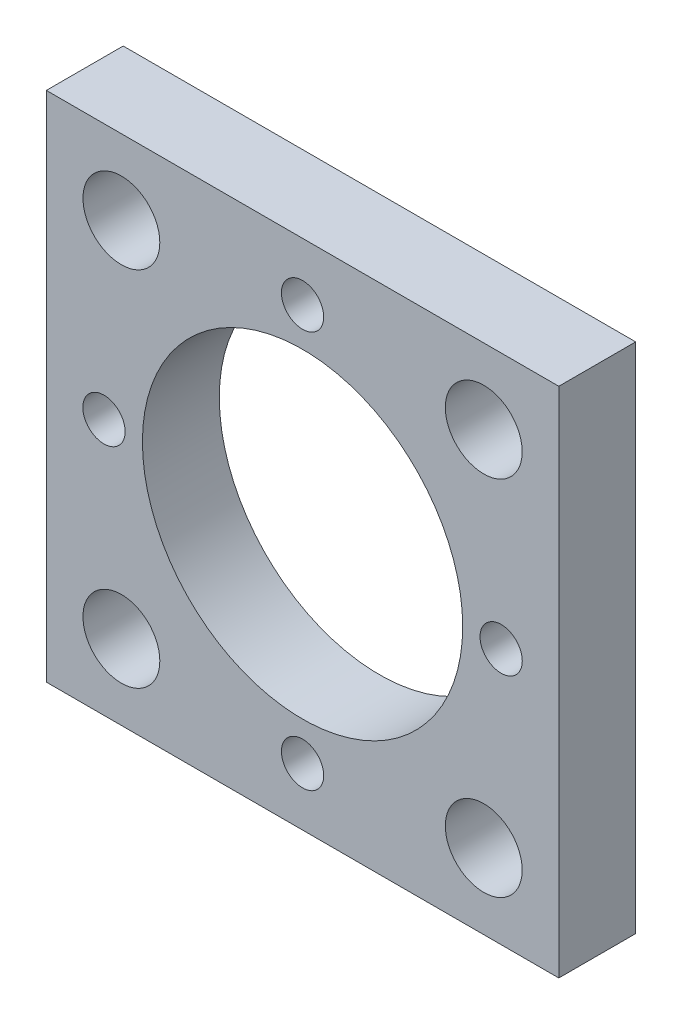
ISO-10303-21;
HEADER;
FILE_DESCRIPTION(('STEP AP214'),'2;1');
FILE_NAME('part.step','',(''),(''),'','','');
FILE_SCHEMA(('AUTOMOTIVE_DESIGN { 1 0 10303 214 1 1 1 1 }'));
ENDSEC;
DATA;
#1=APPLICATION_CONTEXT('core data for automotive mechanical design processes');
#2=APPLICATION_PROTOCOL_DEFINITION('international standard','automotive_design',2000,#1);
#3=PRODUCT_CONTEXT('',#1,'mechanical');
#4=PRODUCT('Part','Part','',(#3));
#5=PRODUCT_RELATED_PRODUCT_CATEGORY('part','',(#4));
#6=PRODUCT_DEFINITION_FORMATION('','',#4);
#7=PRODUCT_DEFINITION_CONTEXT('part definition',#1,'design');
#8=PRODUCT_DEFINITION('design','',#6,#7);
#9=PRODUCT_DEFINITION_SHAPE('','',#8);
#10=(LENGTH_UNIT() NAMED_UNIT(*) SI_UNIT(.MILLI.,.METRE.));
#11=(NAMED_UNIT(*) PLANE_ANGLE_UNIT() SI_UNIT($,.RADIAN.));
#12=(NAMED_UNIT(*) SI_UNIT($,.STERADIAN.) SOLID_ANGLE_UNIT());
#13=UNCERTAINTY_MEASURE_WITH_UNIT(LENGTH_MEASURE(1.E-05),#10,'distance_accuracy_value','');
#14=(GEOMETRIC_REPRESENTATION_CONTEXT(3) GLOBAL_UNCERTAINTY_ASSIGNED_CONTEXT((#13)) GLOBAL_UNIT_ASSIGNED_CONTEXT((#10,
#11,#12)) REPRESENTATION_CONTEXT('',''));
#15=CARTESIAN_POINT('',(0.,0.,0.));
#16=DIRECTION('',(0.,0.,1.));
#17=DIRECTION('',(1.,0.,0.));
#18=AXIS2_PLACEMENT_3D('',#15,#16,#17);
#19=CARTESIAN_POINT('',(0.,0.,6.));
#20=DIRECTION('',(1.,0.,0.));
#21=DIRECTION('',(0.,0.,-1.));
#22=AXIS2_PLACEMENT_3D('',#19,#20,#21);
#23=PLANE('',#22);
#24=DIRECTION('',(0.,-1.,0.));
#25=VECTOR('',#24,1.);
#26=CARTESIAN_POINT('',(0.,0.,0.));
#27=LINE('',#26,#25);
#28=CARTESIAN_POINT('',(0.,40.,0.));
#29=VERTEX_POINT('',#28);
#30=CARTESIAN_POINT('',(0.,0.,0.));
#31=VERTEX_POINT('',#30);
#32=EDGE_CURVE('E102',#29,#31,#27,.T.);
#33=ORIENTED_EDGE('',*,*,#32,.T.);
#34=DIRECTION('',(0.,0.,-1.));
#35=VECTOR('',#34,1.);
#36=CARTESIAN_POINT('',(0.,0.,6.));
#37=LINE('',#36,#35);
#38=CARTESIAN_POINT('',(0.,0.,6.));
#39=VERTEX_POINT('',#38);
#40=EDGE_CURVE('E11',#39,#31,#37,.T.);
#41=ORIENTED_EDGE('',*,*,#40,.F.);
#42=DIRECTION('',(0.,-1.,0.));
#43=VECTOR('',#42,1.);
#44=CARTESIAN_POINT('',(0.,0.,6.));
#45=LINE('',#44,#43);
#46=CARTESIAN_POINT('',(0.,40.,6.));
#47=VERTEX_POINT('',#46);
#48=EDGE_CURVE('E90',#47,#39,#45,.T.);
#49=ORIENTED_EDGE('',*,*,#48,.F.);
#50=DIRECTION('',(0.,0.,-1.));
#51=VECTOR('',#50,1.);
#52=CARTESIAN_POINT('',(0.,40.,6.));
#53=LINE('',#52,#51);
#54=EDGE_CURVE('E98',#47,#29,#53,.T.);
#55=ORIENTED_EDGE('',*,*,#54,.T.);
#56=EDGE_LOOP('',(#33,#41,#49,#55));
#57=FACE_BOUND('',#56,.T.);
#58=ADVANCED_FACE('F39',(#57),#23,.F.);
#59=CARTESIAN_POINT('',(0.,0.,6.));
#60=DIRECTION('',(0.,1.,0.));
#61=DIRECTION('',(0.,0.,1.));
#62=AXIS2_PLACEMENT_3D('',#59,#60,#61);
#63=PLANE('',#62);
#64=DIRECTION('',(1.,0.,0.));
#65=VECTOR('',#64,1.);
#66=CARTESIAN_POINT('',(0.,0.,0.));
#67=LINE('',#66,#65);
#68=CARTESIAN_POINT('',(40.,0.,0.));
#69=VERTEX_POINT('',#68);
#70=EDGE_CURVE('E94',#31,#69,#67,.T.);
#71=ORIENTED_EDGE('',*,*,#70,.T.);
#72=DIRECTION('',(0.,0.,-1.));
#73=VECTOR('',#72,1.);
#74=CARTESIAN_POINT('',(40.,0.,6.));
#75=LINE('',#74,#73);
#76=CARTESIAN_POINT('',(40.,0.,6.));
#77=VERTEX_POINT('',#76);
#78=EDGE_CURVE('E47',#77,#69,#75,.T.);
#79=ORIENTED_EDGE('',*,*,#78,.F.);
#80=DIRECTION('',(1.,0.,0.));
#81=VECTOR('',#80,1.);
#82=CARTESIAN_POINT('',(0.,0.,6.));
#83=LINE('',#82,#81);
#84=EDGE_CURVE('E85',#39,#77,#83,.T.);
#85=ORIENTED_EDGE('',*,*,#84,.F.);
#86=ORIENTED_EDGE('',*,*,#40,.T.);
#87=EDGE_LOOP('',(#71,#79,#85,#86));
#88=FACE_BOUND('',#87,.T.);
#89=ADVANCED_FACE('F93',(#88),#63,.F.);
#90=CARTESIAN_POINT('',(40.,0.,6.));
#91=DIRECTION('',(-1.,0.,0.));
#92=DIRECTION('',(0.,0.,1.));
#93=AXIS2_PLACEMENT_3D('',#90,#91,#92);
#94=PLANE('',#93);
#95=DIRECTION('',(0.,1.,0.));
#96=VECTOR('',#95,1.);
#97=CARTESIAN_POINT('',(40.,0.,0.));
#98=LINE('',#97,#96);
#99=CARTESIAN_POINT('',(40.,40.,0.));
#100=VERTEX_POINT('',#99);
#101=EDGE_CURVE('E72',#69,#100,#98,.T.);
#102=ORIENTED_EDGE('',*,*,#101,.T.);
#103=DIRECTION('',(0.,0.,-1.));
#104=VECTOR('',#103,1.);
#105=CARTESIAN_POINT('',(40.,40.,6.));
#106=LINE('',#105,#104);
#107=CARTESIAN_POINT('',(40.,40.,6.));
#108=VERTEX_POINT('',#107);
#109=EDGE_CURVE('E95',#108,#100,#106,.T.);
#110=ORIENTED_EDGE('',*,*,#109,.F.);
#111=DIRECTION('',(0.,1.,0.));
#112=VECTOR('',#111,1.);
#113=CARTESIAN_POINT('',(40.,0.,6.));
#114=LINE('',#113,#112);
#115=EDGE_CURVE('E88',#77,#108,#114,.T.);
#116=ORIENTED_EDGE('',*,*,#115,.F.);
#117=ORIENTED_EDGE('',*,*,#78,.T.);
#118=EDGE_LOOP('',(#102,#110,#116,#117));
#119=FACE_BOUND('',#118,.T.);
#120=ADVANCED_FACE('F96',(#119),#94,.F.);
#121=CARTESIAN_POINT('',(0.,40.,6.));
#122=DIRECTION('',(0.,-1.,0.));
#123=DIRECTION('',(0.,0.,-1.));
#124=AXIS2_PLACEMENT_3D('',#121,#122,#123);
#125=PLANE('',#124);
#126=DIRECTION('',(-1.,0.,0.));
#127=VECTOR('',#126,1.);
#128=CARTESIAN_POINT('',(0.,40.,0.));
#129=LINE('',#128,#127);
#130=EDGE_CURVE('E78',#100,#29,#129,.T.);
#131=ORIENTED_EDGE('',*,*,#130,.T.);
#132=ORIENTED_EDGE('',*,*,#54,.F.);
#133=DIRECTION('',(-1.,0.,0.));
#134=VECTOR('',#133,1.);
#135=CARTESIAN_POINT('',(0.,40.,6.));
#136=LINE('',#135,#134);
#137=EDGE_CURVE('E55',#108,#47,#136,.T.);
#138=ORIENTED_EDGE('',*,*,#137,.F.);
#139=ORIENTED_EDGE('',*,*,#109,.T.);
#140=EDGE_LOOP('',(#131,#132,#138,#139));
#141=FACE_BOUND('',#140,.T.);
#142=ADVANCED_FACE('F110',(#141),#125,.F.);
#143=CARTESIAN_POINT('',(0.,0.,6.));
#144=DIRECTION('',(0.,0.,-1.));
#145=DIRECTION('',(-1.,0.,0.));
#146=AXIS2_PLACEMENT_3D('',#143,#144,#145);
#147=PLANE('',#146);
#148=CARTESIAN_POINT('',(20.,35.5,6.));
#149=DIRECTION('',(0.,0.,1.));
#150=DIRECTION('',(1.,0.,0.));
#151=AXIS2_PLACEMENT_3D('',#148,#149,#150);
#152=CIRCLE('',#151,1.65);
#153=CARTESIAN_POINT('',(21.65,35.5,6.));
#154=VERTEX_POINT('',#153);
#155=EDGE_CURVE('E166',#154,#154,#152,.T.);
#156=ORIENTED_EDGE('',*,*,#155,.F.);
#157=EDGE_LOOP('',(#156));
#158=FACE_BOUND('',#157,.T.);
#159=CARTESIAN_POINT('',(35.5000000000002,20.0000000000002,6.));
#160=DIRECTION('',(0.,0.,1.));
#161=DIRECTION('',(1.,0.,0.));
#162=AXIS2_PLACEMENT_3D('',#159,#160,#161);
#163=CIRCLE('',#162,1.65);
#164=CARTESIAN_POINT('',(37.1500000000002,20.0000000000002,6.));
#165=VERTEX_POINT('',#164);
#166=EDGE_CURVE('E160',#165,#165,#163,.T.);
#167=ORIENTED_EDGE('',*,*,#166,.F.);
#168=EDGE_LOOP('',(#167));
#169=FACE_BOUND('',#168,.T.);
#170=CARTESIAN_POINT('',(20.0000000000005,4.5,6.));
#171=DIRECTION('',(0.,0.,1.));
#172=DIRECTION('',(1.,0.,0.));
#173=AXIS2_PLACEMENT_3D('',#170,#171,#172);
#174=CIRCLE('',#173,1.65);
#175=CARTESIAN_POINT('',(21.6500000000005,4.5,6.));
#176=VERTEX_POINT('',#175);
#177=EDGE_CURVE('E154',#176,#176,#174,.T.);
#178=ORIENTED_EDGE('',*,*,#177,.F.);
#179=EDGE_LOOP('',(#178));
#180=FACE_BOUND('',#179,.T.);
#181=CARTESIAN_POINT('',(4.50000000000024,19.9999999999998,6.));
#182=DIRECTION('',(0.,0.,1.));
#183=DIRECTION('',(1.,0.,0.));
#184=AXIS2_PLACEMENT_3D('',#181,#182,#183);
#185=CIRCLE('',#184,1.65);
#186=CARTESIAN_POINT('',(6.15000000000024,19.9999999999998,6.));
#187=VERTEX_POINT('',#186);
#188=EDGE_CURVE('E148',#187,#187,#185,.T.);
#189=ORIENTED_EDGE('',*,*,#188,.F.);
#190=EDGE_LOOP('',(#189));
#191=FACE_BOUND('',#190,.T.);
#192=CARTESIAN_POINT('',(20.,20.,6.));
#193=DIRECTION('',(0.,0.,1.));
#194=DIRECTION('',(1.,0.,0.));
#195=AXIS2_PLACEMENT_3D('',#192,#193,#194);
#196=CIRCLE('',#195,12.5);
#197=CARTESIAN_POINT('',(32.5,20.,6.));
#198=VERTEX_POINT('',#197);
#199=EDGE_CURVE('E140',#198,#198,#196,.T.);
#200=ORIENTED_EDGE('',*,*,#199,.F.);
#201=EDGE_LOOP('',(#200));
#202=FACE_BOUND('',#201,.T.);
#203=CARTESIAN_POINT('',(5.85786437626904,34.142135623731,6.));
#204=DIRECTION('',(0.,0.,1.));
#205=DIRECTION('',(1.,0.,0.));
#206=AXIS2_PLACEMENT_3D('',#203,#204,#205);
#207=CIRCLE('',#206,3.);
#208=CARTESIAN_POINT('',(8.85786437626904,34.142135623731,6.));
#209=VERTEX_POINT('',#208);
#210=EDGE_CURVE('E136',#209,#209,#207,.T.);
#211=ORIENTED_EDGE('',*,*,#210,.F.);
#212=EDGE_LOOP('',(#211));
#213=FACE_BOUND('',#212,.T.);
#214=CARTESIAN_POINT('',(34.142135623731,34.1421356237313,6.));
#215=DIRECTION('',(0.,0.,1.));
#216=DIRECTION('',(1.,0.,0.));
#217=AXIS2_PLACEMENT_3D('',#214,#215,#216);
#218=CIRCLE('',#217,3.);
#219=CARTESIAN_POINT('',(37.142135623731,34.1421356237313,6.));
#220=VERTEX_POINT('',#219);
#221=EDGE_CURVE('E130',#220,#220,#218,.T.);
#222=ORIENTED_EDGE('',*,*,#221,.F.);
#223=EDGE_LOOP('',(#222));
#224=FACE_BOUND('',#223,.T.);
#225=CARTESIAN_POINT('',(34.1421356237313,5.85786437626934,6.));
#226=DIRECTION('',(0.,0.,1.));
#227=DIRECTION('',(1.,0.,0.));
#228=AXIS2_PLACEMENT_3D('',#225,#226,#227);
#229=CIRCLE('',#228,3.);
#230=CARTESIAN_POINT('',(37.1421356237313,5.85786437626934,6.));
#231=VERTEX_POINT('',#230);
#232=EDGE_CURVE('E124',#231,#231,#229,.T.);
#233=ORIENTED_EDGE('',*,*,#232,.F.);
#234=EDGE_LOOP('',(#233));
#235=FACE_BOUND('',#234,.T.);
#236=CARTESIAN_POINT('',(5.85786437626929,5.85786437626919,6.));
#237=DIRECTION('',(0.,0.,1.));
#238=DIRECTION('',(1.,0.,0.));
#239=AXIS2_PLACEMENT_3D('',#236,#237,#238);
#240=CIRCLE('',#239,3.);
#241=CARTESIAN_POINT('',(8.85786437626929,5.85786437626919,6.));
#242=VERTEX_POINT('',#241);
#243=EDGE_CURVE('E118',#242,#242,#240,.T.);
#244=ORIENTED_EDGE('',*,*,#243,.F.);
#245=EDGE_LOOP('',(#244));
#246=FACE_BOUND('',#245,.T.);
#247=ORIENTED_EDGE('',*,*,#48,.T.);
#248=ORIENTED_EDGE('',*,*,#84,.T.);
#249=ORIENTED_EDGE('',*,*,#115,.T.);
#250=ORIENTED_EDGE('',*,*,#137,.T.);
#251=EDGE_LOOP('',(#247,#248,#249,#250));
#252=FACE_BOUND('',#251,.T.);
#253=ADVANCED_FACE('F86',(#158,#169,#180,#191,#202,#213,#224,#235,#246,#252),#147,.F.);
#254=CARTESIAN_POINT('',(0.,0.,0.));
#255=DIRECTION('',(0.,0.,-1.));
#256=DIRECTION('',(-1.,0.,0.));
#257=AXIS2_PLACEMENT_3D('',#254,#255,#256);
#258=PLANE('',#257);
#259=CARTESIAN_POINT('',(20.,35.5,0.));
#260=DIRECTION('',(0.,0.,1.));
#261=DIRECTION('',(1.,0.,0.));
#262=AXIS2_PLACEMENT_3D('',#259,#260,#261);
#263=CIRCLE('',#262,1.65);
#264=CARTESIAN_POINT('',(21.65,35.5,0.));
#265=VERTEX_POINT('',#264);
#266=EDGE_CURVE('E163',#265,#265,#263,.T.);
#267=ORIENTED_EDGE('',*,*,#266,.T.);
#268=EDGE_LOOP('',(#267));
#269=FACE_BOUND('',#268,.T.);
#270=CARTESIAN_POINT('',(35.5000000000002,20.0000000000002,0.));
#271=DIRECTION('',(0.,0.,1.));
#272=DIRECTION('',(1.,0.,0.));
#273=AXIS2_PLACEMENT_3D('',#270,#271,#272);
#274=CIRCLE('',#273,1.65);
#275=CARTESIAN_POINT('',(37.1500000000002,20.0000000000002,0.));
#276=VERTEX_POINT('',#275);
#277=EDGE_CURVE('E157',#276,#276,#274,.T.);
#278=ORIENTED_EDGE('',*,*,#277,.T.);
#279=EDGE_LOOP('',(#278));
#280=FACE_BOUND('',#279,.T.);
#281=CARTESIAN_POINT('',(20.0000000000005,4.5,0.));
#282=DIRECTION('',(0.,0.,1.));
#283=DIRECTION('',(1.,0.,0.));
#284=AXIS2_PLACEMENT_3D('',#281,#282,#283);
#285=CIRCLE('',#284,1.65);
#286=CARTESIAN_POINT('',(21.6500000000005,4.5,0.));
#287=VERTEX_POINT('',#286);
#288=EDGE_CURVE('E151',#287,#287,#285,.T.);
#289=ORIENTED_EDGE('',*,*,#288,.T.);
#290=EDGE_LOOP('',(#289));
#291=FACE_BOUND('',#290,.T.);
#292=CARTESIAN_POINT('',(4.50000000000024,19.9999999999998,0.));
#293=DIRECTION('',(0.,0.,1.));
#294=DIRECTION('',(1.,0.,0.));
#295=AXIS2_PLACEMENT_3D('',#292,#293,#294);
#296=CIRCLE('',#295,1.65);
#297=CARTESIAN_POINT('',(6.15000000000024,19.9999999999998,0.));
#298=VERTEX_POINT('',#297);
#299=EDGE_CURVE('E143',#298,#298,#296,.T.);
#300=ORIENTED_EDGE('',*,*,#299,.T.);
#301=EDGE_LOOP('',(#300));
#302=FACE_BOUND('',#301,.T.);
#303=CARTESIAN_POINT('',(20.,20.,0.));
#304=DIRECTION('',(0.,0.,1.));
#305=DIRECTION('',(1.,0.,0.));
#306=AXIS2_PLACEMENT_3D('',#303,#304,#305);
#307=CIRCLE('',#306,12.5);
#308=CARTESIAN_POINT('',(32.5,20.,0.));
#309=VERTEX_POINT('',#308);
#310=EDGE_CURVE('E139',#309,#309,#307,.T.);
#311=ORIENTED_EDGE('',*,*,#310,.T.);
#312=EDGE_LOOP('',(#311));
#313=FACE_BOUND('',#312,.T.);
#314=CARTESIAN_POINT('',(5.85786437626904,34.142135623731,0.));
#315=DIRECTION('',(0.,0.,1.));
#316=DIRECTION('',(1.,0.,0.));
#317=AXIS2_PLACEMENT_3D('',#314,#315,#316);
#318=CIRCLE('',#317,3.);
#319=CARTESIAN_POINT('',(8.85786437626904,34.142135623731,0.));
#320=VERTEX_POINT('',#319);
#321=EDGE_CURVE('E133',#320,#320,#318,.T.);
#322=ORIENTED_EDGE('',*,*,#321,.T.);
#323=EDGE_LOOP('',(#322));
#324=FACE_BOUND('',#323,.T.);
#325=CARTESIAN_POINT('',(34.142135623731,34.1421356237313,0.));
#326=DIRECTION('',(0.,0.,1.));
#327=DIRECTION('',(1.,0.,0.));
#328=AXIS2_PLACEMENT_3D('',#325,#326,#327);
#329=CIRCLE('',#328,3.);
#330=CARTESIAN_POINT('',(37.142135623731,34.1421356237313,0.));
#331=VERTEX_POINT('',#330);
#332=EDGE_CURVE('E127',#331,#331,#329,.T.);
#333=ORIENTED_EDGE('',*,*,#332,.T.);
#334=EDGE_LOOP('',(#333));
#335=FACE_BOUND('',#334,.T.);
#336=CARTESIAN_POINT('',(34.1421356237313,5.85786437626934,0.));
#337=DIRECTION('',(0.,0.,1.));
#338=DIRECTION('',(1.,0.,0.));
#339=AXIS2_PLACEMENT_3D('',#336,#337,#338);
#340=CIRCLE('',#339,3.);
#341=CARTESIAN_POINT('',(37.1421356237313,5.85786437626934,0.));
#342=VERTEX_POINT('',#341);
#343=EDGE_CURVE('E121',#342,#342,#340,.T.);
#344=ORIENTED_EDGE('',*,*,#343,.T.);
#345=EDGE_LOOP('',(#344));
#346=FACE_BOUND('',#345,.T.);
#347=CARTESIAN_POINT('',(5.85786437626929,5.85786437626919,0.));
#348=DIRECTION('',(0.,0.,1.));
#349=DIRECTION('',(1.,0.,0.));
#350=AXIS2_PLACEMENT_3D('',#347,#348,#349);
#351=CIRCLE('',#350,3.);
#352=CARTESIAN_POINT('',(8.85786437626929,5.85786437626919,0.));
#353=VERTEX_POINT('',#352);
#354=EDGE_CURVE('E105',#353,#353,#351,.T.);
#355=ORIENTED_EDGE('',*,*,#354,.T.);
#356=EDGE_LOOP('',(#355));
#357=FACE_BOUND('',#356,.T.);
#358=ORIENTED_EDGE('',*,*,#32,.F.);
#359=ORIENTED_EDGE('',*,*,#130,.F.);
#360=ORIENTED_EDGE('',*,*,#101,.F.);
#361=ORIENTED_EDGE('',*,*,#70,.F.);
#362=EDGE_LOOP('',(#358,#359,#360,#361));
#363=FACE_BOUND('',#362,.T.);
#364=ADVANCED_FACE('F113',(#269,#280,#291,#302,#313,#324,#335,#346,#357,#363),#258,.T.);
#365=CARTESIAN_POINT('',(5.85786437626929,5.85786437626919,6.));
#366=DIRECTION('',(0.,0.,1.));
#367=DIRECTION('',(1.,0.,0.));
#368=AXIS2_PLACEMENT_3D('',#365,#366,#367);
#369=CYLINDRICAL_SURFACE('',#368,3.);
#370=ORIENTED_EDGE('',*,*,#354,.F.);
#371=EDGE_LOOP('',(#370));
#372=FACE_BOUND('',#371,.T.);
#373=ORIENTED_EDGE('',*,*,#243,.T.);
#374=EDGE_LOOP('',(#373));
#375=FACE_BOUND('',#374,.T.);
#376=ADVANCED_FACE('F191',(#372,#375),#369,.F.);
#377=CARTESIAN_POINT('',(34.1421356237313,5.85786437626934,6.));
#378=DIRECTION('',(0.,0.,1.));
#379=DIRECTION('',(1.,0.,0.));
#380=AXIS2_PLACEMENT_3D('',#377,#378,#379);
#381=CYLINDRICAL_SURFACE('',#380,3.);
#382=ORIENTED_EDGE('',*,*,#343,.F.);
#383=EDGE_LOOP('',(#382));
#384=FACE_BOUND('',#383,.T.);
#385=ORIENTED_EDGE('',*,*,#232,.T.);
#386=EDGE_LOOP('',(#385));
#387=FACE_BOUND('',#386,.T.);
#388=ADVANCED_FACE('F193',(#384,#387),#381,.F.);
#389=CARTESIAN_POINT('',(34.142135623731,34.1421356237313,6.));
#390=DIRECTION('',(0.,0.,1.));
#391=DIRECTION('',(1.,0.,0.));
#392=AXIS2_PLACEMENT_3D('',#389,#390,#391);
#393=CYLINDRICAL_SURFACE('',#392,3.);
#394=ORIENTED_EDGE('',*,*,#332,.F.);
#395=EDGE_LOOP('',(#394));
#396=FACE_BOUND('',#395,.T.);
#397=ORIENTED_EDGE('',*,*,#221,.T.);
#398=EDGE_LOOP('',(#397));
#399=FACE_BOUND('',#398,.T.);
#400=ADVANCED_FACE('F200',(#396,#399),#393,.F.);
#401=CARTESIAN_POINT('',(5.85786437626904,34.142135623731,6.));
#402=DIRECTION('',(0.,0.,1.));
#403=DIRECTION('',(1.,0.,0.));
#404=AXIS2_PLACEMENT_3D('',#401,#402,#403);
#405=CYLINDRICAL_SURFACE('',#404,3.);
#406=ORIENTED_EDGE('',*,*,#321,.F.);
#407=EDGE_LOOP('',(#406));
#408=FACE_BOUND('',#407,.T.);
#409=ORIENTED_EDGE('',*,*,#210,.T.);
#410=EDGE_LOOP('',(#409));
#411=FACE_BOUND('',#410,.T.);
#412=ADVANCED_FACE('F260',(#408,#411),#405,.F.);
#413=CARTESIAN_POINT('',(20.,20.,0.));
#414=DIRECTION('',(0.,0.,1.));
#415=DIRECTION('',(1.,0.,0.));
#416=AXIS2_PLACEMENT_3D('',#413,#414,#415);
#417=CYLINDRICAL_SURFACE('',#416,12.5);
#418=ORIENTED_EDGE('',*,*,#310,.F.);
#419=EDGE_LOOP('',(#418));
#420=FACE_BOUND('',#419,.T.);
#421=ORIENTED_EDGE('',*,*,#199,.T.);
#422=EDGE_LOOP('',(#421));
#423=FACE_BOUND('',#422,.T.);
#424=ADVANCED_FACE('F269',(#420,#423),#417,.F.);
#425=CARTESIAN_POINT('',(4.50000000000024,19.9999999999998,6.));
#426=DIRECTION('',(0.,0.,1.));
#427=DIRECTION('',(1.,0.,0.));
#428=AXIS2_PLACEMENT_3D('',#425,#426,#427);
#429=CYLINDRICAL_SURFACE('',#428,1.65);
#430=ORIENTED_EDGE('',*,*,#299,.F.);
#431=EDGE_LOOP('',(#430));
#432=FACE_BOUND('',#431,.T.);
#433=ORIENTED_EDGE('',*,*,#188,.T.);
#434=EDGE_LOOP('',(#433));
#435=FACE_BOUND('',#434,.T.);
#436=ADVANCED_FACE('F278',(#432,#435),#429,.F.);
#437=CARTESIAN_POINT('',(20.0000000000005,4.5,6.));
#438=DIRECTION('',(0.,0.,1.));
#439=DIRECTION('',(1.,0.,0.));
#440=AXIS2_PLACEMENT_3D('',#437,#438,#439);
#441=CYLINDRICAL_SURFACE('',#440,1.65);
#442=ORIENTED_EDGE('',*,*,#288,.F.);
#443=EDGE_LOOP('',(#442));
#444=FACE_BOUND('',#443,.T.);
#445=ORIENTED_EDGE('',*,*,#177,.T.);
#446=EDGE_LOOP('',(#445));
#447=FACE_BOUND('',#446,.T.);
#448=ADVANCED_FACE('F287',(#444,#447),#441,.F.);
#449=CARTESIAN_POINT('',(35.5000000000002,20.0000000000002,6.));
#450=DIRECTION('',(0.,0.,1.));
#451=DIRECTION('',(1.,0.,0.));
#452=AXIS2_PLACEMENT_3D('',#449,#450,#451);
#453=CYLINDRICAL_SURFACE('',#452,1.65);
#454=ORIENTED_EDGE('',*,*,#277,.F.);
#455=EDGE_LOOP('',(#454));
#456=FACE_BOUND('',#455,.T.);
#457=ORIENTED_EDGE('',*,*,#166,.T.);
#458=EDGE_LOOP('',(#457));
#459=FACE_BOUND('',#458,.T.);
#460=ADVANCED_FACE('F296',(#456,#459),#453,.F.);
#461=CARTESIAN_POINT('',(20.,35.5,6.));
#462=DIRECTION('',(0.,0.,1.));
#463=DIRECTION('',(1.,0.,0.));
#464=AXIS2_PLACEMENT_3D('',#461,#462,#463);
#465=CYLINDRICAL_SURFACE('',#464,1.65);
#466=ORIENTED_EDGE('',*,*,#266,.F.);
#467=EDGE_LOOP('',(#466));
#468=FACE_BOUND('',#467,.T.);
#469=ORIENTED_EDGE('',*,*,#155,.T.);
#470=EDGE_LOOP('',(#469));
#471=FACE_BOUND('',#470,.T.);
#472=ADVANCED_FACE('F170',(#468,#471),#465,.F.);
#473=CLOSED_SHELL('',(#58,#89,#120,#142,#253,#364,#376,#388,#400,#412,#424,#436,#448,#460,#472));
#474=MANIFOLD_SOLID_BREP('B2',#473);
#475=ADVANCED_BREP_SHAPE_REPRESENTATION('',(#18,#474),#14);
#476=SHAPE_DEFINITION_REPRESENTATION(#9,#475);
ENDSEC;
END-ISO-10303-21;
